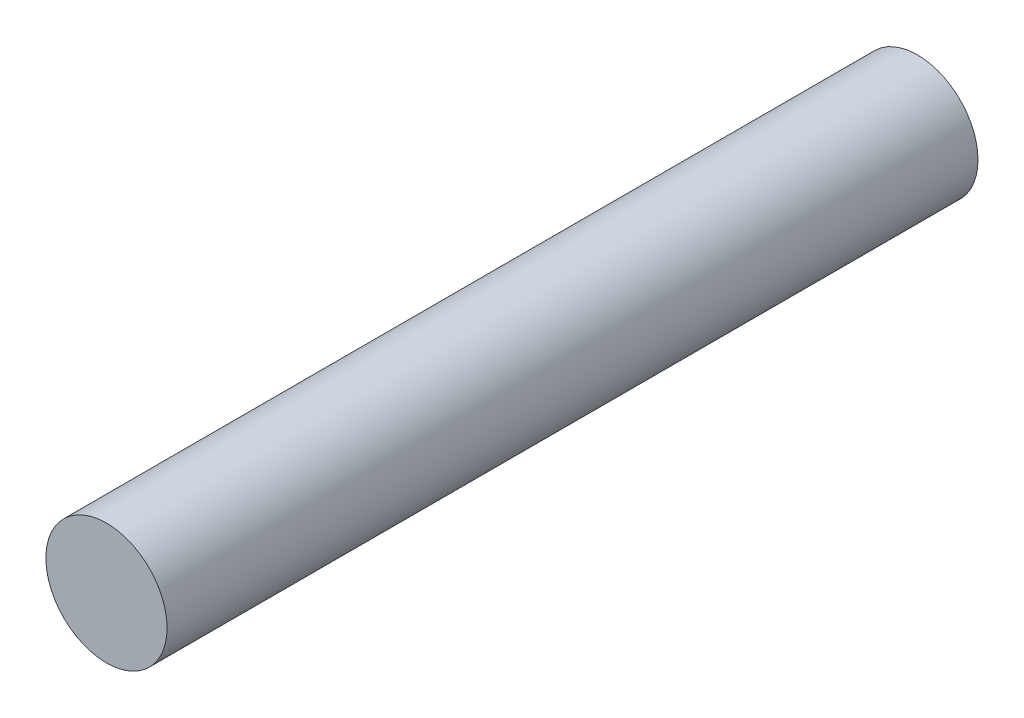
ISO-10303-21;
HEADER;
FILE_DESCRIPTION(('STEP AP214'),'2;1');
FILE_NAME('part.step','',(''),(''),'','','');
FILE_SCHEMA(('AUTOMOTIVE_DESIGN { 1 0 10303 214 1 1 1 1 }'));
ENDSEC;
DATA;
#1=APPLICATION_CONTEXT('core data for automotive mechanical design processes');
#2=APPLICATION_PROTOCOL_DEFINITION('international standard','automotive_design',2000,#1);
#3=PRODUCT_CONTEXT('',#1,'mechanical');
#4=PRODUCT('Part','Part','',(#3));
#5=PRODUCT_RELATED_PRODUCT_CATEGORY('part','',(#4));
#6=PRODUCT_DEFINITION_FORMATION('','',#4);
#7=PRODUCT_DEFINITION_CONTEXT('part definition',#1,'design');
#8=PRODUCT_DEFINITION('design','',#6,#7);
#9=PRODUCT_DEFINITION_SHAPE('','',#8);
#10=(LENGTH_UNIT() NAMED_UNIT(*) SI_UNIT(.MILLI.,.METRE.));
#11=(NAMED_UNIT(*) PLANE_ANGLE_UNIT() SI_UNIT($,.RADIAN.));
#12=(NAMED_UNIT(*) SI_UNIT($,.STERADIAN.) SOLID_ANGLE_UNIT());
#13=UNCERTAINTY_MEASURE_WITH_UNIT(LENGTH_MEASURE(1.E-05),#10,'distance_accuracy_value','');
#14=(GEOMETRIC_REPRESENTATION_CONTEXT(3) GLOBAL_UNCERTAINTY_ASSIGNED_CONTEXT((#13)) GLOBAL_UNIT_ASSIGNED_CONTEXT((#10,
#11,#12)) REPRESENTATION_CONTEXT('',''));
#15=CARTESIAN_POINT('',(0.,0.,0.));
#16=DIRECTION('',(0.,0.,1.));
#17=DIRECTION('',(1.,0.,0.));
#18=AXIS2_PLACEMENT_3D('',#15,#16,#17);
#19=CARTESIAN_POINT('',(0.,0.,339.852));
#20=DIRECTION('',(0.,0.,-1.));
#21=DIRECTION('',(-1.,0.,0.));
#22=AXIS2_PLACEMENT_3D('',#19,#20,#21);
#23=CYLINDRICAL_SURFACE('',#22,25.4);
#24=CARTESIAN_POINT('',(0.,0.,339.852));
#25=DIRECTION('',(0.,0.,1.));
#26=DIRECTION('',(1.,0.,0.));
#27=AXIS2_PLACEMENT_3D('',#24,#25,#26);
#28=CIRCLE('',#27,25.4);
#29=CARTESIAN_POINT('',(25.4,0.,339.852));
#30=VERTEX_POINT('',#29);
#31=EDGE_CURVE('E10',#30,#30,#28,.T.);
#32=ORIENTED_EDGE('',*,*,#31,.F.);
#33=EDGE_LOOP('',(#32));
#34=FACE_BOUND('',#33,.T.);
#35=CARTESIAN_POINT('',(0.,0.,0.));
#36=DIRECTION('',(0.,0.,1.));
#37=DIRECTION('',(1.,0.,0.));
#38=AXIS2_PLACEMENT_3D('',#35,#36,#37);
#39=CIRCLE('',#38,25.4);
#40=CARTESIAN_POINT('',(25.4,0.,0.));
#41=VERTEX_POINT('',#40);
#42=EDGE_CURVE('E34',#41,#41,#39,.T.);
#43=ORIENTED_EDGE('',*,*,#42,.T.);
#44=EDGE_LOOP('',(#43));
#45=FACE_BOUND('',#44,.T.);
#46=ADVANCED_FACE('F31',(#34,#45),#23,.T.);
#47=CARTESIAN_POINT('',(0.,0.,339.852));
#48=DIRECTION('',(0.,0.,1.));
#49=DIRECTION('',(1.,0.,0.));
#50=AXIS2_PLACEMENT_3D('',#47,#48,#49);
#51=PLANE('',#50);
#52=ORIENTED_EDGE('',*,*,#31,.T.);
#53=EDGE_LOOP('',(#52));
#54=FACE_BOUND('',#53,.T.);
#55=ADVANCED_FACE('F46',(#54),#51,.T.);
#56=CARTESIAN_POINT('',(0.,0.,0.));
#57=DIRECTION('',(0.,0.,1.));
#58=DIRECTION('',(1.,0.,0.));
#59=AXIS2_PLACEMENT_3D('',#56,#57,#58);
#60=PLANE('',#59);
#61=ORIENTED_EDGE('',*,*,#42,.F.);
#62=EDGE_LOOP('',(#61));
#63=FACE_BOUND('',#62,.T.);
#64=ADVANCED_FACE('F44',(#63),#60,.F.);
#65=CLOSED_SHELL('',(#46,#55,#64));
#66=MANIFOLD_SOLID_BREP('B2',#65);
#67=ADVANCED_BREP_SHAPE_REPRESENTATION('',(#18,#66),#14);
#68=SHAPE_DEFINITION_REPRESENTATION(#9,#67);
ENDSEC;
END-ISO-10303-21;
